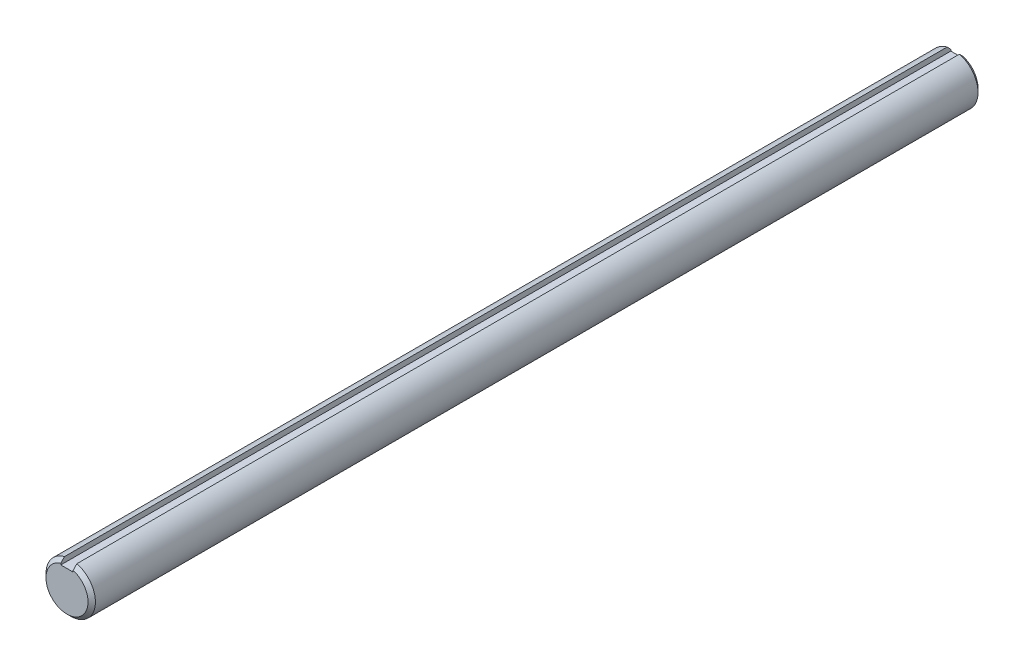
ISO-10303-21;
HEADER;
FILE_DESCRIPTION(('STEP AP214'),'2;1');
FILE_NAME('part.step','',(''),(''),'','','');
FILE_SCHEMA(('AUTOMOTIVE_DESIGN { 1 0 10303 214 1 1 1 1 }'));
ENDSEC;
DATA;
#1=APPLICATION_CONTEXT('core data for automotive mechanical design processes');
#2=APPLICATION_PROTOCOL_DEFINITION('international standard','automotive_design',2000,#1);
#3=PRODUCT_CONTEXT('',#1,'mechanical');
#4=PRODUCT('Part','Part','',(#3));
#5=PRODUCT_RELATED_PRODUCT_CATEGORY('part','',(#4));
#6=PRODUCT_DEFINITION_FORMATION('','',#4);
#7=PRODUCT_DEFINITION_CONTEXT('part definition',#1,'design');
#8=PRODUCT_DEFINITION('design','',#6,#7);
#9=PRODUCT_DEFINITION_SHAPE('','',#8);
#10=(LENGTH_UNIT() NAMED_UNIT(*) SI_UNIT(.MILLI.,.METRE.));
#11=(NAMED_UNIT(*) PLANE_ANGLE_UNIT() SI_UNIT($,.RADIAN.));
#12=(NAMED_UNIT(*) SI_UNIT($,.STERADIAN.) SOLID_ANGLE_UNIT());
#13=UNCERTAINTY_MEASURE_WITH_UNIT(LENGTH_MEASURE(1.E-05),#10,'distance_accuracy_value','');
#14=(GEOMETRIC_REPRESENTATION_CONTEXT(3) GLOBAL_UNCERTAINTY_ASSIGNED_CONTEXT((#13)) GLOBAL_UNIT_ASSIGNED_CONTEXT((#10,
#11,#12)) REPRESENTATION_CONTEXT('',''));
#15=CARTESIAN_POINT('',(0.,0.,0.));
#16=DIRECTION('',(0.,0.,1.));
#17=DIRECTION('',(1.,0.,0.));
#18=AXIS2_PLACEMENT_3D('',#15,#16,#17);
#19=CARTESIAN_POINT('',(0.,0.,114.3));
#20=DIRECTION('',(0.,0.,-1.));
#21=DIRECTION('',(-1.,0.,0.));
#22=AXIS2_PLACEMENT_3D('',#19,#20,#21);
#23=CYLINDRICAL_SURFACE('',#22,6.35);
#24=CARTESIAN_POINT('',(0.,0.,113.3475));
#25=DIRECTION('',(0.,0.,1.));
#26=DIRECTION('',(1.,0.,0.));
#27=AXIS2_PLACEMENT_3D('',#24,#25,#26);
#28=CIRCLE('',#27,6.35);
#29=CARTESIAN_POINT('',(1.5875,6.14836106210427,113.3475));
#30=VERTEX_POINT('',#29);
#31=CARTESIAN_POINT('',(-1.5875,6.14836106210427,113.3475));
#32=VERTEX_POINT('',#31);
#33=EDGE_CURVE('E152',#30,#32,#28,.F.);
#34=ORIENTED_EDGE('',*,*,#33,.T.);
#35=DIRECTION('',(0.,0.,-1.));
#36=VECTOR('',#35,1.);
#37=CARTESIAN_POINT('',(-1.5875,6.14836106210427,114.3));
#38=LINE('',#37,#36);
#39=CARTESIAN_POINT('',(-1.5875,6.14836106210427,-113.3475));
#40=VERTEX_POINT('',#39);
#41=EDGE_CURVE('E129',#32,#40,#38,.T.);
#42=ORIENTED_EDGE('',*,*,#41,.T.);
#43=CARTESIAN_POINT('',(0.,0.,-113.3475));
#44=DIRECTION('',(0.,0.,1.));
#45=DIRECTION('',(1.,0.,0.));
#46=AXIS2_PLACEMENT_3D('',#43,#44,#45);
#47=CIRCLE('',#46,6.35);
#48=CARTESIAN_POINT('',(1.5875,6.14836106210427,-113.3475));
#49=VERTEX_POINT('',#48);
#50=EDGE_CURVE('E149',#40,#49,#47,.T.);
#51=ORIENTED_EDGE('',*,*,#50,.T.);
#52=DIRECTION('',(0.,0.,-1.));
#53=VECTOR('',#52,1.);
#54=CARTESIAN_POINT('',(1.5875,6.14836106210427,114.3));
#55=LINE('',#54,#53);
#56=EDGE_CURVE('E118',#49,#30,#55,.F.);
#57=ORIENTED_EDGE('',*,*,#56,.T.);
#58=EDGE_LOOP('',(#34,#42,#51,#57));
#59=FACE_BOUND('',#58,.T.);
#60=ADVANCED_FACE('F32',(#59),#23,.T.);
#61=CARTESIAN_POINT('',(0.,0.,114.3));
#62=DIRECTION('',(0.,0.,1.));
#63=DIRECTION('',(1.,0.,0.));
#64=AXIS2_PLACEMENT_3D('',#61,#62,#63);
#65=PLANE('',#64);
#66=DIRECTION('',(0.,-1.,0.));
#67=VECTOR('',#66,1.);
#68=CARTESIAN_POINT('',(-1.5875,6.35,114.3));
#69=LINE('',#68,#67);
#70=CARTESIAN_POINT('',(-1.5875,5.15876438694383,114.3));
#71=VERTEX_POINT('',#70);
#72=CARTESIAN_POINT('',(-1.5875,4.7625,114.3));
#73=VERTEX_POINT('',#72);
#74=EDGE_CURVE('E88',#71,#73,#69,.T.);
#75=ORIENTED_EDGE('',*,*,#74,.F.);
#76=CARTESIAN_POINT('',(0.,0.,114.3));
#77=DIRECTION('',(0.,0.,1.));
#78=DIRECTION('',(1.,0.,0.));
#79=AXIS2_PLACEMENT_3D('',#76,#77,#78);
#80=CIRCLE('',#79,5.3975);
#81=CARTESIAN_POINT('',(1.5875,5.15876438694383,114.3));
#82=VERTEX_POINT('',#81);
#83=EDGE_CURVE('E144',#71,#82,#80,.T.);
#84=ORIENTED_EDGE('',*,*,#83,.T.);
#85=DIRECTION('',(0.,1.,0.));
#86=VECTOR('',#85,1.);
#87=CARTESIAN_POINT('',(1.5875,6.35,114.3));
#88=LINE('',#87,#86);
#89=CARTESIAN_POINT('',(1.5875,4.7625,114.3));
#90=VERTEX_POINT('',#89);
#91=EDGE_CURVE('E53',#90,#82,#88,.T.);
#92=ORIENTED_EDGE('',*,*,#91,.F.);
#93=DIRECTION('',(1.,0.,0.));
#94=VECTOR('',#93,1.);
#95=CARTESIAN_POINT('',(-1.5875,4.7625,114.3));
#96=LINE('',#95,#94);
#97=EDGE_CURVE('E98',#73,#90,#96,.T.);
#98=ORIENTED_EDGE('',*,*,#97,.F.);
#99=EDGE_LOOP('',(#75,#84,#92,#98));
#100=FACE_BOUND('',#99,.T.);
#101=ADVANCED_FACE('F109',(#100),#65,.T.);
#102=CARTESIAN_POINT('',(0.,0.,-114.3));
#103=DIRECTION('',(0.,0.,1.));
#104=DIRECTION('',(1.,0.,0.));
#105=AXIS2_PLACEMENT_3D('',#102,#103,#104);
#106=PLANE('',#105);
#107=CARTESIAN_POINT('',(0.,0.,-114.3));
#108=DIRECTION('',(0.,0.,1.));
#109=DIRECTION('',(1.,0.,0.));
#110=AXIS2_PLACEMENT_3D('',#107,#108,#109);
#111=CIRCLE('',#110,5.39749999999994);
#112=CARTESIAN_POINT('',(1.5875,5.15876438694378,-114.3));
#113=VERTEX_POINT('',#112);
#114=CARTESIAN_POINT('',(-1.5875,5.15876438694378,-114.3));
#115=VERTEX_POINT('',#114);
#116=EDGE_CURVE('E146',#113,#115,#111,.F.);
#117=ORIENTED_EDGE('',*,*,#116,.T.);
#118=DIRECTION('',(0.,-1.,0.));
#119=VECTOR('',#118,1.);
#120=CARTESIAN_POINT('',(-1.5875,6.35,-114.3));
#121=LINE('',#120,#119);
#122=CARTESIAN_POINT('',(-1.5875,4.7625,-114.3));
#123=VERTEX_POINT('',#122);
#124=EDGE_CURVE('E111',#115,#123,#121,.T.);
#125=ORIENTED_EDGE('',*,*,#124,.T.);
#126=DIRECTION('',(1.,0.,0.));
#127=VECTOR('',#126,1.);
#128=CARTESIAN_POINT('',(-1.5875,4.7625,-114.3));
#129=LINE('',#128,#127);
#130=CARTESIAN_POINT('',(1.5875,4.7625,-114.3));
#131=VERTEX_POINT('',#130);
#132=EDGE_CURVE('E104',#123,#131,#129,.T.);
#133=ORIENTED_EDGE('',*,*,#132,.T.);
#134=DIRECTION('',(0.,1.,0.));
#135=VECTOR('',#134,1.);
#136=CARTESIAN_POINT('',(1.5875,6.35,-114.3));
#137=LINE('',#136,#135);
#138=EDGE_CURVE('E107',#131,#113,#137,.T.);
#139=ORIENTED_EDGE('',*,*,#138,.T.);
#140=EDGE_LOOP('',(#117,#125,#133,#139));
#141=FACE_BOUND('',#140,.T.);
#142=ADVANCED_FACE('F164',(#141),#106,.F.);
#143=CARTESIAN_POINT('',(0.,0.,-113.3475));
#144=DIRECTION('',(0.,0.,1.));
#145=DIRECTION('',(1.,0.,0.));
#146=AXIS2_PLACEMENT_3D('',#143,#144,#145);
#147=CONICAL_SURFACE('',#146,6.35,0.785398163397451);
#148=CARTESIAN_POINT('',(-1.5875,2.50467512422009,-116.732107323155));
#149=CARTESIAN_POINT('',(-1.5875,2.61995748799085,-116.634670566395));
#150=CARTESIAN_POINT('',(-1.5875,2.73434819416609,-116.536194096017));
#151=CARTESIAN_POINT('',(-1.5875,2.96171067705001,-116.337631802363));
#152=CARTESIAN_POINT('',(-1.5875,3.07468256144117,-116.23754610255));
#153=CARTESIAN_POINT('',(-1.5875,3.29956921576397,-116.036238361708));
#154=CARTESIAN_POINT('',(-1.5875,3.41148417069848,-115.935016526598));
#155=CARTESIAN_POINT('',(-1.5875,3.63450717009297,-115.731683597431));
#156=CARTESIAN_POINT('',(-1.5875,3.74561519672359,-115.629572483834));
#157=CARTESIAN_POINT('',(-1.5875,4.07794041463343,-115.322275163923));
#158=CARTESIAN_POINT('',(-1.5875,4.29821694512229,-115.116072467645));
#159=CARTESIAN_POINT('',(-1.5875,4.7371591453038,-114.701942304272));
#160=CARTESIAN_POINT('',(-1.5875,4.95582472940177,-114.49401474676));
#161=CARTESIAN_POINT('',(-1.5875,5.39197585155532,-114.07704872991));
#162=CARTESIAN_POINT('',(-1.5875,5.60946170363258,-113.868010598799));
#163=CARTESIAN_POINT('',(-1.5875,6.04362892921902,-113.449111015667));
#164=CARTESIAN_POINT('',(-1.5875,6.26031032050705,-113.239249582055));
#165=CARTESIAN_POINT('',(-1.5875,6.69313054205313,-112.818874652796));
#166=CARTESIAN_POINT('',(-1.5875,6.90926924461324,-112.608361025747));
#167=CARTESIAN_POINT('',(-1.5875,7.34108970538697,-112.186866537556));
#168=CARTESIAN_POINT('',(-1.5875,7.55677146466178,-111.975885677502));
#169=CARTESIAN_POINT('',(-1.5875,7.77229162734196,-111.764740493343));
#170=B_SPLINE_CURVE_WITH_KNOTS('',3,(#148,#149,#150,#151,#152,#153,#154,#155,#156,#157,#158,
#159,#160,#161,#162,#163,#164,#165,#166,#167,#168,#169),.UNSPECIFIED.,.F.,.F.,(4,2,2,2,2,2,2,2,
2,2,4),(0.,0.452810247519122,0.905585918444109,1.35828081011675,1.81098567399955,
2.71616025534629,3.62138258954867,4.52635081760588,5.43129892508631,6.33644306352766,
7.24158509760037),.UNSPECIFIED.);
#171=EDGE_CURVE('E61',#115,#40,#170,.T.);
#172=ORIENTED_EDGE('',*,*,#171,.F.);
#173=ORIENTED_EDGE('',*,*,#116,.F.);
#174=CARTESIAN_POINT('',(1.5875,7.77229162734196,-111.764740493343));
#175=CARTESIAN_POINT('',(1.5875,7.55677146466178,-111.975885677502));
#176=CARTESIAN_POINT('',(1.5875,7.34108970538697,-112.186866537556));
#177=CARTESIAN_POINT('',(1.5875,6.90926924461324,-112.608361025747));
#178=CARTESIAN_POINT('',(1.5875,6.69313054205313,-112.818874652796));
#179=CARTESIAN_POINT('',(1.5875,6.26031032050705,-113.239249582055));
#180=CARTESIAN_POINT('',(1.5875,6.04362892921902,-113.449111015667));
#181=CARTESIAN_POINT('',(1.5875,5.60946170363258,-113.868010598799));
#182=CARTESIAN_POINT('',(1.5875,5.39197585155532,-114.07704872991));
#183=CARTESIAN_POINT('',(1.5875,4.95582472940177,-114.49401474676));
#184=CARTESIAN_POINT('',(1.5875,4.7371591453038,-114.701942304272));
#185=CARTESIAN_POINT('',(1.5875,4.29821694512229,-115.116072467645));
#186=CARTESIAN_POINT('',(1.5875,4.07794041463343,-115.322275163923));
#187=CARTESIAN_POINT('',(1.5875,3.74561519672359,-115.629572483834));
#188=CARTESIAN_POINT('',(1.5875,3.63450717009297,-115.731683597431));
#189=CARTESIAN_POINT('',(1.5875,3.41148417069848,-115.935016526598));
#190=CARTESIAN_POINT('',(1.5875,3.29956921576397,-116.036238361708));
#191=CARTESIAN_POINT('',(1.5875,3.07468256144117,-116.23754610255));
#192=CARTESIAN_POINT('',(1.5875,2.96171067705001,-116.337631802363));
#193=CARTESIAN_POINT('',(1.5875,2.73434819416609,-116.536194096017));
#194=CARTESIAN_POINT('',(1.5875,2.61995748799085,-116.634670566395));
#195=CARTESIAN_POINT('',(1.5875,2.50467512422009,-116.732107323155));
#196=B_SPLINE_CURVE_WITH_KNOTS('',3,(#174,#175,#176,#177,#178,#179,#180,#181,#182,#183,#184,
#185,#186,#187,#188,#189,#190,#191,#192,#193,#194,#195),.UNSPECIFIED.,.F.,.F.,(4,2,2,2,2,2,2,2,
2,2,4),(0.,0.905142034072703,1.81028617251406,2.71523427999448,3.6202025080517,4.52542484225408,
5.43059942360081,5.88330428748361,6.33599917915626,6.78877485008124,7.24158509760037),.UNSPECIFIED.);
#197=EDGE_CURVE('E122',#49,#113,#196,.T.);
#198=ORIENTED_EDGE('',*,*,#197,.F.);
#199=ORIENTED_EDGE('',*,*,#50,.F.);
#200=EDGE_LOOP('',(#172,#173,#198,#199));
#201=FACE_BOUND('',#200,.T.);
#202=ADVANCED_FACE('F131',(#201),#147,.T.);
#203=CARTESIAN_POINT('',(0.,0.,114.3));
#204=DIRECTION('',(0.,0.,-1.));
#205=DIRECTION('',(-1.,0.,0.));
#206=AXIS2_PLACEMENT_3D('',#203,#204,#205);
#207=CONICAL_SURFACE('',#206,5.3975,0.785398163397451);
#208=CARTESIAN_POINT('',(-1.5875,7.77229162734194,111.764740493343));
#209=CARTESIAN_POINT('',(-1.5875,7.55677146466177,111.975885677502));
#210=CARTESIAN_POINT('',(-1.5875,7.34108970538697,112.186866537556));
#211=CARTESIAN_POINT('',(-1.5875,6.90926924461324,112.608361025747));
#212=CARTESIAN_POINT('',(-1.5875,6.69313054205314,112.818874652797));
#213=CARTESIAN_POINT('',(-1.5875,6.26031032050706,113.239249582055));
#214=CARTESIAN_POINT('',(-1.5875,6.04362892921903,113.449111015667));
#215=CARTESIAN_POINT('',(-1.5875,5.60946170363259,113.868010598799));
#216=CARTESIAN_POINT('',(-1.5875,5.39197585155534,114.07704872991));
#217=CARTESIAN_POINT('',(-1.5875,4.95582472940179,114.49401474676));
#218=CARTESIAN_POINT('',(-1.5875,4.73715914530383,114.701942304272));
#219=CARTESIAN_POINT('',(-1.5875,4.29821694512233,115.116072467645));
#220=CARTESIAN_POINT('',(-1.5875,4.07794041463348,115.322275163923));
#221=CARTESIAN_POINT('',(-1.5875,3.74561519672364,115.629572483834));
#222=CARTESIAN_POINT('',(-1.5875,3.63450717009303,115.731683597431));
#223=CARTESIAN_POINT('',(-1.5875,3.41148417069853,115.935016526598));
#224=CARTESIAN_POINT('',(-1.5875,3.29956921576403,116.036238361708));
#225=CARTESIAN_POINT('',(-1.5875,3.07468256144122,116.23754610255));
#226=CARTESIAN_POINT('',(-1.5875,2.96171067705006,116.337631802363));
#227=CARTESIAN_POINT('',(-1.5875,2.73434819416614,116.536194096017));
#228=CARTESIAN_POINT('',(-1.5875,2.6199574879909,116.634670566395));
#229=CARTESIAN_POINT('',(-1.5875,2.50467512422014,116.732107323155));
#230=B_SPLINE_CURVE_WITH_KNOTS('',3,(#208,#209,#210,#211,#212,#213,#214,#215,#216,#217,#218,
#219,#220,#221,#222,#223,#224,#225,#226,#227,#228,#229),.UNSPECIFIED.,.F.,.F.,(4,2,2,2,2,2,2,2,
2,2,4),(0.,0.905142034072687,1.81028617251402,2.71523427999446,3.62020250805166,
4.52542484225402,5.43059942360073,5.88330428748352,6.33599917915616,6.78877485008116,
7.24158509760028),.UNSPECIFIED.);
#231=EDGE_CURVE('E11',#32,#71,#230,.T.);
#232=ORIENTED_EDGE('',*,*,#231,.F.);
#233=ORIENTED_EDGE('',*,*,#33,.F.);
#234=CARTESIAN_POINT('',(1.5875,2.50467512422014,116.732107323155));
#235=CARTESIAN_POINT('',(1.5875,2.61995748799089,116.634670566395));
#236=CARTESIAN_POINT('',(1.5875,2.73434819416613,116.536194096017));
#237=CARTESIAN_POINT('',(1.5875,2.96171067705006,116.337631802363));
#238=CARTESIAN_POINT('',(1.5875,3.07468256144121,116.23754610255));
#239=CARTESIAN_POINT('',(1.5875,3.29956921576401,116.036238361708));
#240=CARTESIAN_POINT('',(1.5875,3.41148417069851,115.935016526598));
#241=CARTESIAN_POINT('',(1.5875,3.63450717009301,115.731683597431));
#242=CARTESIAN_POINT('',(1.5875,3.74561519672362,115.629572483834));
#243=CARTESIAN_POINT('',(1.5875,4.07794041463347,115.322275163923));
#244=CARTESIAN_POINT('',(1.5875,4.29821694512232,115.116072467645));
#245=CARTESIAN_POINT('',(1.5875,4.73715914530382,114.701942304272));
#246=CARTESIAN_POINT('',(1.5875,4.95582472940179,114.49401474676));
#247=CARTESIAN_POINT('',(1.5875,5.39197585155534,114.07704872991));
#248=CARTESIAN_POINT('',(1.5875,5.60946170363259,113.868010598799));
#249=CARTESIAN_POINT('',(1.5875,6.04362892921903,113.449111015667));
#250=CARTESIAN_POINT('',(1.5875,6.26031032050706,113.239249582055));
#251=CARTESIAN_POINT('',(1.5875,6.69313054205314,112.818874652797));
#252=CARTESIAN_POINT('',(1.5875,6.90926924461324,112.608361025747));
#253=CARTESIAN_POINT('',(1.5875,7.34108970538697,112.186866537556));
#254=CARTESIAN_POINT('',(1.5875,7.55677146466177,111.975885677502));
#255=CARTESIAN_POINT('',(1.5875,7.77229162734194,111.764740493343));
#256=B_SPLINE_CURVE_WITH_KNOTS('',3,(#234,#235,#236,#237,#238,#239,#240,#241,#242,#243,#244,
#245,#246,#247,#248,#249,#250,#251,#252,#253,#254,#255),.UNSPECIFIED.,.F.,.F.,(4,2,2,2,2,2,2,2,
2,2,4),(0.,0.452810247519121,0.905585918444106,1.35828081011674,1.81098567399953,
2.71616025534626,3.62138258954863,4.52635081760582,5.43129892508626,6.3364430635276,
7.24158509760028),.UNSPECIFIED.);
#257=EDGE_CURVE('E46',#82,#30,#256,.T.);
#258=ORIENTED_EDGE('',*,*,#257,.F.);
#259=ORIENTED_EDGE('',*,*,#83,.F.);
#260=EDGE_LOOP('',(#232,#233,#258,#259));
#261=FACE_BOUND('',#260,.T.);
#262=ADVANCED_FACE('F34',(#261),#207,.T.);
#263=CARTESIAN_POINT('',(-1.5875,6.35,-114.3));
#264=DIRECTION('',(-1.,0.,0.));
#265=DIRECTION('',(0.,-1.,0.));
#266=AXIS2_PLACEMENT_3D('',#263,#264,#265);
#267=PLANE('',#266);
#268=ORIENTED_EDGE('',*,*,#171,.T.);
#269=ORIENTED_EDGE('',*,*,#41,.F.);
#270=ORIENTED_EDGE('',*,*,#231,.T.);
#271=ORIENTED_EDGE('',*,*,#74,.T.);
#272=DIRECTION('',(0.,0.,1.));
#273=VECTOR('',#272,1.);
#274=CARTESIAN_POINT('',(-1.5875,4.7625,-114.3));
#275=LINE('',#274,#273);
#276=EDGE_CURVE('E91',#123,#73,#275,.T.);
#277=ORIENTED_EDGE('',*,*,#276,.F.);
#278=ORIENTED_EDGE('',*,*,#124,.F.);
#279=EDGE_LOOP('',(#268,#269,#270,#271,#277,#278));
#280=FACE_BOUND('',#279,.T.);
#281=ADVANCED_FACE('F90',(#280),#267,.F.);
#282=CARTESIAN_POINT('',(1.5875,6.35,-114.3));
#283=DIRECTION('',(1.,0.,0.));
#284=DIRECTION('',(0.,1.,0.));
#285=AXIS2_PLACEMENT_3D('',#282,#283,#284);
#286=PLANE('',#285);
#287=ORIENTED_EDGE('',*,*,#197,.T.);
#288=ORIENTED_EDGE('',*,*,#138,.F.);
#289=DIRECTION('',(0.,0.,1.));
#290=VECTOR('',#289,1.);
#291=CARTESIAN_POINT('',(1.5875,4.7625,-114.3));
#292=LINE('',#291,#290);
#293=EDGE_CURVE('E106',#131,#90,#292,.T.);
#294=ORIENTED_EDGE('',*,*,#293,.T.);
#295=ORIENTED_EDGE('',*,*,#91,.T.);
#296=ORIENTED_EDGE('',*,*,#257,.T.);
#297=ORIENTED_EDGE('',*,*,#56,.F.);
#298=EDGE_LOOP('',(#287,#288,#294,#295,#296,#297));
#299=FACE_BOUND('',#298,.T.);
#300=ADVANCED_FACE('F134',(#299),#286,.F.);
#301=CARTESIAN_POINT('',(-1.5875,4.7625,-114.3));
#302=DIRECTION('',(0.,-1.,0.));
#303=DIRECTION('',(0.,0.,-1.));
#304=AXIS2_PLACEMENT_3D('',#301,#302,#303);
#305=PLANE('',#304);
#306=ORIENTED_EDGE('',*,*,#293,.F.);
#307=ORIENTED_EDGE('',*,*,#132,.F.);
#308=ORIENTED_EDGE('',*,*,#276,.T.);
#309=ORIENTED_EDGE('',*,*,#97,.T.);
#310=EDGE_LOOP('',(#306,#307,#308,#309));
#311=FACE_BOUND('',#310,.T.);
#312=ADVANCED_FACE('F102',(#311),#305,.F.);
#313=CLOSED_SHELL('',(#60,#101,#142,#202,#262,#281,#300,#312));
#314=MANIFOLD_SOLID_BREP('B2',#313);
#315=ADVANCED_BREP_SHAPE_REPRESENTATION('',(#18,#314),#14);
#316=SHAPE_DEFINITION_REPRESENTATION(#9,#315);
ENDSEC;
END-ISO-10303-21;
